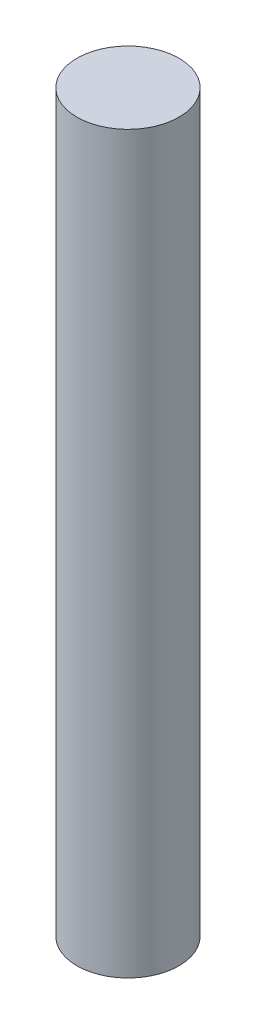
ISO-10303-21;
HEADER;
FILE_DESCRIPTION(('STEP AP214'),'2;1');
FILE_NAME('part.step','',(''),(''),'','','');
FILE_SCHEMA(('AUTOMOTIVE_DESIGN { 1 0 10303 214 1 1 1 1 }'));
ENDSEC;
DATA;
#1=APPLICATION_CONTEXT('core data for automotive mechanical design processes');
#2=APPLICATION_PROTOCOL_DEFINITION('international standard','automotive_design',2000,#1);
#3=PRODUCT_CONTEXT('',#1,'mechanical');
#4=PRODUCT('Part','Part','',(#3));
#5=PRODUCT_RELATED_PRODUCT_CATEGORY('part','',(#4));
#6=PRODUCT_DEFINITION_FORMATION('','',#4);
#7=PRODUCT_DEFINITION_CONTEXT('part definition',#1,'design');
#8=PRODUCT_DEFINITION('design','',#6,#7);
#9=PRODUCT_DEFINITION_SHAPE('','',#8);
#10=(LENGTH_UNIT() NAMED_UNIT(*) SI_UNIT(.MILLI.,.METRE.));
#11=(NAMED_UNIT(*) PLANE_ANGLE_UNIT() SI_UNIT($,.RADIAN.));
#12=(NAMED_UNIT(*) SI_UNIT($,.STERADIAN.) SOLID_ANGLE_UNIT());
#13=UNCERTAINTY_MEASURE_WITH_UNIT(LENGTH_MEASURE(1.E-05),#10,'distance_accuracy_value','');
#14=(GEOMETRIC_REPRESENTATION_CONTEXT(3) GLOBAL_UNCERTAINTY_ASSIGNED_CONTEXT((#13)) GLOBAL_UNIT_ASSIGNED_CONTEXT((#10,
#11,#12)) REPRESENTATION_CONTEXT('',''));
#15=CARTESIAN_POINT('',(0.,0.,0.));
#16=DIRECTION('',(0.,0.,1.));
#17=DIRECTION('',(1.,0.,0.));
#18=AXIS2_PLACEMENT_3D('',#15,#16,#17);
#19=CARTESIAN_POINT('',(0.,57.15,0.));
#20=DIRECTION('',(0.,-1.,0.));
#21=DIRECTION('',(0.,0.,-1.));
#22=AXIS2_PLACEMENT_3D('',#19,#20,#21);
#23=CYLINDRICAL_SURFACE('',#22,3.96875);
#24=CARTESIAN_POINT('',(0.,57.15,0.));
#25=DIRECTION('',(0.,1.,0.));
#26=DIRECTION('',(0.,0.,1.));
#27=AXIS2_PLACEMENT_3D('',#24,#25,#26);
#28=CIRCLE('',#27,3.96875);
#29=CARTESIAN_POINT('',(0.,57.15,3.96875));
#30=VERTEX_POINT('',#29);
#31=EDGE_CURVE('E10',#30,#30,#28,.T.);
#32=ORIENTED_EDGE('',*,*,#31,.F.);
#33=EDGE_LOOP('',(#32));
#34=FACE_BOUND('',#33,.T.);
#35=CARTESIAN_POINT('',(0.,0.,0.));
#36=DIRECTION('',(0.,1.,0.));
#37=DIRECTION('',(0.,0.,1.));
#38=AXIS2_PLACEMENT_3D('',#35,#36,#37);
#39=CIRCLE('',#38,3.96875);
#40=CARTESIAN_POINT('',(0.,0.,3.96875));
#41=VERTEX_POINT('',#40);
#42=EDGE_CURVE('E46',#41,#41,#39,.T.);
#43=ORIENTED_EDGE('',*,*,#42,.T.);
#44=EDGE_LOOP('',(#43));
#45=FACE_BOUND('',#44,.T.);
#46=ADVANCED_FACE('F43',(#34,#45),#23,.T.);
#47=CARTESIAN_POINT('',(0.,57.15,0.));
#48=DIRECTION('',(0.,1.,0.));
#49=DIRECTION('',(0.,0.,1.));
#50=AXIS2_PLACEMENT_3D('',#47,#48,#49);
#51=PLANE('',#50);
#52=ORIENTED_EDGE('',*,*,#31,.T.);
#53=EDGE_LOOP('',(#52));
#54=FACE_BOUND('',#53,.T.);
#55=ADVANCED_FACE('F60',(#54),#51,.T.);
#56=CARTESIAN_POINT('',(0.,0.,0.));
#57=DIRECTION('',(0.,1.,0.));
#58=DIRECTION('',(0.,0.,1.));
#59=AXIS2_PLACEMENT_3D('',#56,#57,#58);
#60=PLANE('',#59);
#61=ORIENTED_EDGE('',*,*,#42,.F.);
#62=EDGE_LOOP('',(#61));
#63=FACE_BOUND('',#62,.T.);
#64=ADVANCED_FACE('F58',(#63),#60,.F.);
#65=CLOSED_SHELL('',(#46,#55,#64));
#66=MANIFOLD_SOLID_BREP('B2',#65);
#67=ADVANCED_BREP_SHAPE_REPRESENTATION('',(#18,#66),#14);
#68=SHAPE_DEFINITION_REPRESENTATION(#9,#67);
ENDSEC;
END-ISO-10303-21;
